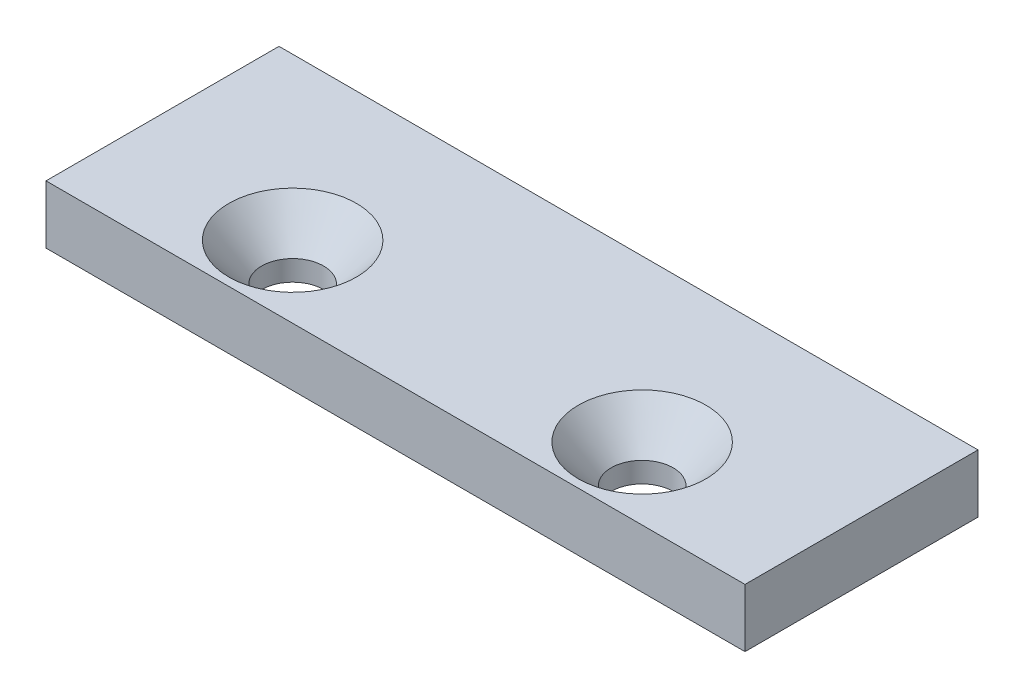
ISO-10303-21;
HEADER;
FILE_DESCRIPTION(('STEP AP214'),'2;1');
FILE_NAME('part.step','',(''),(''),'','','');
FILE_SCHEMA(('AUTOMOTIVE_DESIGN { 1 0 10303 214 1 1 1 1 }'));
ENDSEC;
DATA;
#1=APPLICATION_CONTEXT('core data for automotive mechanical design processes');
#2=APPLICATION_PROTOCOL_DEFINITION('international standard','automotive_design',2000,#1);
#3=PRODUCT_CONTEXT('',#1,'mechanical');
#4=PRODUCT('Part','Part','',(#3));
#5=PRODUCT_RELATED_PRODUCT_CATEGORY('part','',(#4));
#6=PRODUCT_DEFINITION_FORMATION('','',#4);
#7=PRODUCT_DEFINITION_CONTEXT('part definition',#1,'design');
#8=PRODUCT_DEFINITION('design','',#6,#7);
#9=PRODUCT_DEFINITION_SHAPE('','',#8);
#10=(LENGTH_UNIT() NAMED_UNIT(*) SI_UNIT(.MILLI.,.METRE.));
#11=(NAMED_UNIT(*) PLANE_ANGLE_UNIT() SI_UNIT($,.RADIAN.));
#12=(NAMED_UNIT(*) SI_UNIT($,.STERADIAN.) SOLID_ANGLE_UNIT());
#13=UNCERTAINTY_MEASURE_WITH_UNIT(LENGTH_MEASURE(1.E-05),#10,'distance_accuracy_value','');
#14=(GEOMETRIC_REPRESENTATION_CONTEXT(3) GLOBAL_UNCERTAINTY_ASSIGNED_CONTEXT((#13)) GLOBAL_UNIT_ASSIGNED_CONTEXT((#10,
#11,#12)) REPRESENTATION_CONTEXT('',''));
#15=CARTESIAN_POINT('',(0.,0.,0.));
#16=DIRECTION('',(0.,0.,1.));
#17=DIRECTION('',(1.,0.,0.));
#18=AXIS2_PLACEMENT_3D('',#15,#16,#17);
#19=CARTESIAN_POINT('',(0.,-6.35,0.));
#20=DIRECTION('',(-1.,0.,0.));
#21=DIRECTION('',(0.,0.,1.));
#22=AXIS2_PLACEMENT_3D('',#19,#20,#21);
#23=PLANE('',#22);
#24=DIRECTION('',(0.,0.,1.));
#25=VECTOR('',#24,1.);
#26=CARTESIAN_POINT('',(0.,0.,0.));
#27=LINE('',#26,#25);
#28=CARTESIAN_POINT('',(0.,0.,-25.4));
#29=VERTEX_POINT('',#28);
#30=CARTESIAN_POINT('',(0.,0.,0.));
#31=VERTEX_POINT('',#30);
#32=EDGE_CURVE('E97',#29,#31,#27,.T.);
#33=ORIENTED_EDGE('',*,*,#32,.F.);
#34=DIRECTION('',(0.,1.,0.));
#35=VECTOR('',#34,1.);
#36=CARTESIAN_POINT('',(0.,-6.35,-25.4));
#37=LINE('',#36,#35);
#38=CARTESIAN_POINT('',(0.,-6.35,-25.4));
#39=VERTEX_POINT('',#38);
#40=EDGE_CURVE('E11',#39,#29,#37,.T.);
#41=ORIENTED_EDGE('',*,*,#40,.F.);
#42=DIRECTION('',(0.,0.,1.));
#43=VECTOR('',#42,1.);
#44=CARTESIAN_POINT('',(0.,-6.35,0.));
#45=LINE('',#44,#43);
#46=CARTESIAN_POINT('',(0.,-6.35,0.));
#47=VERTEX_POINT('',#46);
#48=EDGE_CURVE('E90',#39,#47,#45,.T.);
#49=ORIENTED_EDGE('',*,*,#48,.T.);
#50=DIRECTION('',(0.,1.,0.));
#51=VECTOR('',#50,1.);
#52=CARTESIAN_POINT('',(0.,-6.35,0.));
#53=LINE('',#52,#51);
#54=EDGE_CURVE('E35',#47,#31,#53,.T.);
#55=ORIENTED_EDGE('',*,*,#54,.T.);
#56=EDGE_LOOP('',(#33,#41,#49,#55));
#57=FACE_BOUND('',#56,.T.);
#58=ADVANCED_FACE('F32',(#57),#23,.T.);
#59=CARTESIAN_POINT('',(0.,-6.35,-25.4));
#60=DIRECTION('',(0.,0.,-1.));
#61=DIRECTION('',(-1.,0.,0.));
#62=AXIS2_PLACEMENT_3D('',#59,#60,#61);
#63=PLANE('',#62);
#64=DIRECTION('',(-1.,0.,0.));
#65=VECTOR('',#64,1.);
#66=CARTESIAN_POINT('',(0.,0.,-25.4));
#67=LINE('',#66,#65);
#68=CARTESIAN_POINT('',(76.2,0.,-25.4));
#69=VERTEX_POINT('',#68);
#70=EDGE_CURVE('E92',#69,#29,#67,.T.);
#71=ORIENTED_EDGE('',*,*,#70,.F.);
#72=DIRECTION('',(0.,1.,0.));
#73=VECTOR('',#72,1.);
#74=CARTESIAN_POINT('',(76.2,-6.35,-25.4));
#75=LINE('',#74,#73);
#76=CARTESIAN_POINT('',(76.2,-6.35,-25.4));
#77=VERTEX_POINT('',#76);
#78=EDGE_CURVE('E41',#77,#69,#75,.T.);
#79=ORIENTED_EDGE('',*,*,#78,.F.);
#80=DIRECTION('',(-1.,0.,0.));
#81=VECTOR('',#80,1.);
#82=CARTESIAN_POINT('',(0.,-6.35,-25.4));
#83=LINE('',#82,#81);
#84=EDGE_CURVE('E87',#77,#39,#83,.T.);
#85=ORIENTED_EDGE('',*,*,#84,.T.);
#86=ORIENTED_EDGE('',*,*,#40,.T.);
#87=EDGE_LOOP('',(#71,#79,#85,#86));
#88=FACE_BOUND('',#87,.T.);
#89=ADVANCED_FACE('F108',(#88),#63,.T.);
#90=CARTESIAN_POINT('',(76.2,-6.35,0.));
#91=DIRECTION('',(1.,0.,0.));
#92=DIRECTION('',(0.,0.,-1.));
#93=AXIS2_PLACEMENT_3D('',#90,#91,#92);
#94=PLANE('',#93);
#95=DIRECTION('',(0.,0.,-1.));
#96=VECTOR('',#95,1.);
#97=CARTESIAN_POINT('',(76.2,0.,0.));
#98=LINE('',#97,#96);
#99=CARTESIAN_POINT('',(76.2,0.,0.));
#100=VERTEX_POINT('',#99);
#101=EDGE_CURVE('E82',#100,#69,#98,.T.);
#102=ORIENTED_EDGE('',*,*,#101,.F.);
#103=DIRECTION('',(0.,1.,0.));
#104=VECTOR('',#103,1.);
#105=CARTESIAN_POINT('',(76.2,-6.35,0.));
#106=LINE('',#105,#104);
#107=CARTESIAN_POINT('',(76.2,-6.35,0.));
#108=VERTEX_POINT('',#107);
#109=EDGE_CURVE('E77',#108,#100,#106,.T.);
#110=ORIENTED_EDGE('',*,*,#109,.F.);
#111=DIRECTION('',(0.,0.,-1.));
#112=VECTOR('',#111,1.);
#113=CARTESIAN_POINT('',(76.2,-6.35,0.));
#114=LINE('',#113,#112);
#115=EDGE_CURVE('E80',#108,#77,#114,.T.);
#116=ORIENTED_EDGE('',*,*,#115,.T.);
#117=ORIENTED_EDGE('',*,*,#78,.T.);
#118=EDGE_LOOP('',(#102,#110,#116,#117));
#119=FACE_BOUND('',#118,.T.);
#120=ADVANCED_FACE('F79',(#119),#94,.T.);
#121=CARTESIAN_POINT('',(0.,-6.35,0.));
#122=DIRECTION('',(0.,0.,1.));
#123=DIRECTION('',(1.,0.,0.));
#124=AXIS2_PLACEMENT_3D('',#121,#122,#123);
#125=PLANE('',#124);
#126=DIRECTION('',(1.,0.,0.));
#127=VECTOR('',#126,1.);
#128=CARTESIAN_POINT('',(0.,0.,0.));
#129=LINE('',#128,#127);
#130=EDGE_CURVE('E100',#31,#100,#129,.T.);
#131=ORIENTED_EDGE('',*,*,#130,.F.);
#132=ORIENTED_EDGE('',*,*,#54,.F.);
#133=DIRECTION('',(1.,0.,0.));
#134=VECTOR('',#133,1.);
#135=CARTESIAN_POINT('',(0.,-6.35,0.));
#136=LINE('',#135,#134);
#137=EDGE_CURVE('E86',#47,#108,#136,.T.);
#138=ORIENTED_EDGE('',*,*,#137,.T.);
#139=ORIENTED_EDGE('',*,*,#109,.T.);
#140=EDGE_LOOP('',(#131,#132,#138,#139));
#141=FACE_BOUND('',#140,.T.);
#142=ADVANCED_FACE('F89',(#141),#125,.T.);
#143=CARTESIAN_POINT('',(0.,-6.35,0.));
#144=DIRECTION('',(0.,-1.,0.));
#145=DIRECTION('',(0.,0.,-1.));
#146=AXIS2_PLACEMENT_3D('',#143,#144,#145);
#147=PLANE('',#146);
#148=CARTESIAN_POINT('',(19.05,-6.35,-7.8393049188196));
#149=DIRECTION('',(0.,1.,0.));
#150=DIRECTION('',(0.,0.,1.));
#151=AXIS2_PLACEMENT_3D('',#148,#149,#150);
#152=CIRCLE('',#151,3.3782);
#153=CARTESIAN_POINT('',(19.05,-6.35,-4.4611049188196));
#154=VERTEX_POINT('',#153);
#155=EDGE_CURVE('E155',#154,#154,#152,.T.);
#156=ORIENTED_EDGE('',*,*,#155,.T.);
#157=EDGE_LOOP('',(#156));
#158=FACE_BOUND('',#157,.T.);
#159=CARTESIAN_POINT('',(57.15,-6.35,-7.8393049188196));
#160=DIRECTION('',(0.,1.,0.));
#161=DIRECTION('',(0.,0.,1.));
#162=AXIS2_PLACEMENT_3D('',#159,#160,#161);
#163=CIRCLE('',#162,3.3782);
#164=CARTESIAN_POINT('',(57.15,-6.35,-4.4611049188196));
#165=VERTEX_POINT('',#164);
#166=EDGE_CURVE('E101',#165,#165,#163,.T.);
#167=ORIENTED_EDGE('',*,*,#166,.T.);
#168=EDGE_LOOP('',(#167));
#169=FACE_BOUND('',#168,.T.);
#170=ORIENTED_EDGE('',*,*,#48,.F.);
#171=ORIENTED_EDGE('',*,*,#84,.F.);
#172=ORIENTED_EDGE('',*,*,#115,.F.);
#173=ORIENTED_EDGE('',*,*,#137,.F.);
#174=EDGE_LOOP('',(#170,#171,#172,#173));
#175=FACE_BOUND('',#174,.T.);
#176=ADVANCED_FACE('F85',(#158,#169,#175),#147,.T.);
#177=CARTESIAN_POINT('',(0.,0.,0.));
#178=DIRECTION('',(0.,-1.,0.));
#179=DIRECTION('',(0.,0.,-1.));
#180=AXIS2_PLACEMENT_3D('',#177,#178,#179);
#181=PLANE('',#180);
#182=CARTESIAN_POINT('',(19.05,0.,-7.8393049188196));
#183=DIRECTION('',(0.,1.,0.));
#184=DIRECTION('',(0.,0.,1.));
#185=AXIS2_PLACEMENT_3D('',#182,#183,#184);
#186=CIRCLE('',#185,6.9596);
#187=CARTESIAN_POINT('',(19.05,0.,-0.879704918819602));
#188=VERTEX_POINT('',#187);
#189=EDGE_CURVE('E153',#188,#188,#186,.T.);
#190=ORIENTED_EDGE('',*,*,#189,.F.);
#191=EDGE_LOOP('',(#190));
#192=FACE_BOUND('',#191,.T.);
#193=CARTESIAN_POINT('',(57.15,0.,-7.8393049188196));
#194=DIRECTION('',(0.,1.,0.));
#195=DIRECTION('',(0.,0.,1.));
#196=AXIS2_PLACEMENT_3D('',#193,#194,#195);
#197=CIRCLE('',#196,6.9596);
#198=CARTESIAN_POINT('',(57.15,0.,-0.879704918819606));
#199=VERTEX_POINT('',#198);
#200=EDGE_CURVE('E159',#199,#199,#197,.T.);
#201=ORIENTED_EDGE('',*,*,#200,.F.);
#202=EDGE_LOOP('',(#201));
#203=FACE_BOUND('',#202,.T.);
#204=ORIENTED_EDGE('',*,*,#32,.T.);
#205=ORIENTED_EDGE('',*,*,#130,.T.);
#206=ORIENTED_EDGE('',*,*,#101,.T.);
#207=ORIENTED_EDGE('',*,*,#70,.T.);
#208=EDGE_LOOP('',(#204,#205,#206,#207));
#209=FACE_BOUND('',#208,.T.);
#210=ADVANCED_FACE('F107',(#192,#203,#209),#181,.F.);
#211=CARTESIAN_POINT('',(57.15,0.,-7.8393049188196));
#212=DIRECTION('',(0.,1.,0.));
#213=DIRECTION('',(0.,0.,1.));
#214=AXIS2_PLACEMENT_3D('',#211,#212,#213);
#215=CYLINDRICAL_SURFACE('',#214,3.3782);
#216=ORIENTED_EDGE('',*,*,#166,.F.);
#217=EDGE_LOOP('',(#216));
#218=FACE_BOUND('',#217,.T.);
#219=CARTESIAN_POINT('',(57.15,-4.11992941362132,-7.8393049188196));
#220=DIRECTION('',(0.,1.,0.));
#221=DIRECTION('',(0.,0.,1.));
#222=AXIS2_PLACEMENT_3D('',#219,#220,#221);
#223=CIRCLE('',#222,3.3782);
#224=CARTESIAN_POINT('',(57.15,-4.11992941362132,-4.4611049188196));
#225=VERTEX_POINT('',#224);
#226=EDGE_CURVE('E162',#225,#225,#223,.T.);
#227=ORIENTED_EDGE('',*,*,#226,.T.);
#228=EDGE_LOOP('',(#227));
#229=FACE_BOUND('',#228,.T.);
#230=ADVANCED_FACE('F126',(#218,#229),#215,.F.);
#231=CARTESIAN_POINT('',(57.15,0.,-7.8393049188196));
#232=DIRECTION('',(0.,1.,0.));
#233=DIRECTION('',(0.,0.,1.));
#234=AXIS2_PLACEMENT_3D('',#231,#232,#233);
#235=CONICAL_SURFACE('',#234,6.9596,0.715584993317675);
#236=ORIENTED_EDGE('',*,*,#226,.F.);
#237=EDGE_LOOP('',(#236));
#238=FACE_BOUND('',#237,.T.);
#239=ORIENTED_EDGE('',*,*,#200,.T.);
#240=EDGE_LOOP('',(#239));
#241=FACE_BOUND('',#240,.T.);
#242=ADVANCED_FACE('F133',(#238,#241),#235,.F.);
#243=CARTESIAN_POINT('',(19.05,0.,-7.8393049188196));
#244=DIRECTION('',(0.,1.,0.));
#245=DIRECTION('',(0.,0.,1.));
#246=AXIS2_PLACEMENT_3D('',#243,#244,#245);
#247=CYLINDRICAL_SURFACE('',#246,3.3782);
#248=ORIENTED_EDGE('',*,*,#155,.F.);
#249=EDGE_LOOP('',(#248));
#250=FACE_BOUND('',#249,.T.);
#251=CARTESIAN_POINT('',(19.05,-4.11992941362132,-7.8393049188196));
#252=DIRECTION('',(0.,1.,0.));
#253=DIRECTION('',(0.,0.,1.));
#254=AXIS2_PLACEMENT_3D('',#251,#252,#253);
#255=CIRCLE('',#254,3.3782);
#256=CARTESIAN_POINT('',(19.05,-4.11992941362132,-4.4611049188196));
#257=VERTEX_POINT('',#256);
#258=EDGE_CURVE('E150',#257,#257,#255,.T.);
#259=ORIENTED_EDGE('',*,*,#258,.T.);
#260=EDGE_LOOP('',(#259));
#261=FACE_BOUND('',#260,.T.);
#262=ADVANCED_FACE('F137',(#250,#261),#247,.F.);
#263=CARTESIAN_POINT('',(19.05,0.,-7.8393049188196));
#264=DIRECTION('',(0.,1.,0.));
#265=DIRECTION('',(0.,0.,1.));
#266=AXIS2_PLACEMENT_3D('',#263,#264,#265);
#267=CONICAL_SURFACE('',#266,6.9596,0.715584993317675);
#268=ORIENTED_EDGE('',*,*,#258,.F.);
#269=EDGE_LOOP('',(#268));
#270=FACE_BOUND('',#269,.T.);
#271=ORIENTED_EDGE('',*,*,#189,.T.);
#272=EDGE_LOOP('',(#271));
#273=FACE_BOUND('',#272,.T.);
#274=ADVANCED_FACE('F141',(#270,#273),#267,.F.);
#275=CLOSED_SHELL('',(#58,#89,#120,#142,#176,#210,#230,#242,#262,#274));
#276=MANIFOLD_SOLID_BREP('B2',#275);
#277=ADVANCED_BREP_SHAPE_REPRESENTATION('',(#18,#276),#14);
#278=SHAPE_DEFINITION_REPRESENTATION(#9,#277);
ENDSEC;
END-ISO-10303-21;
